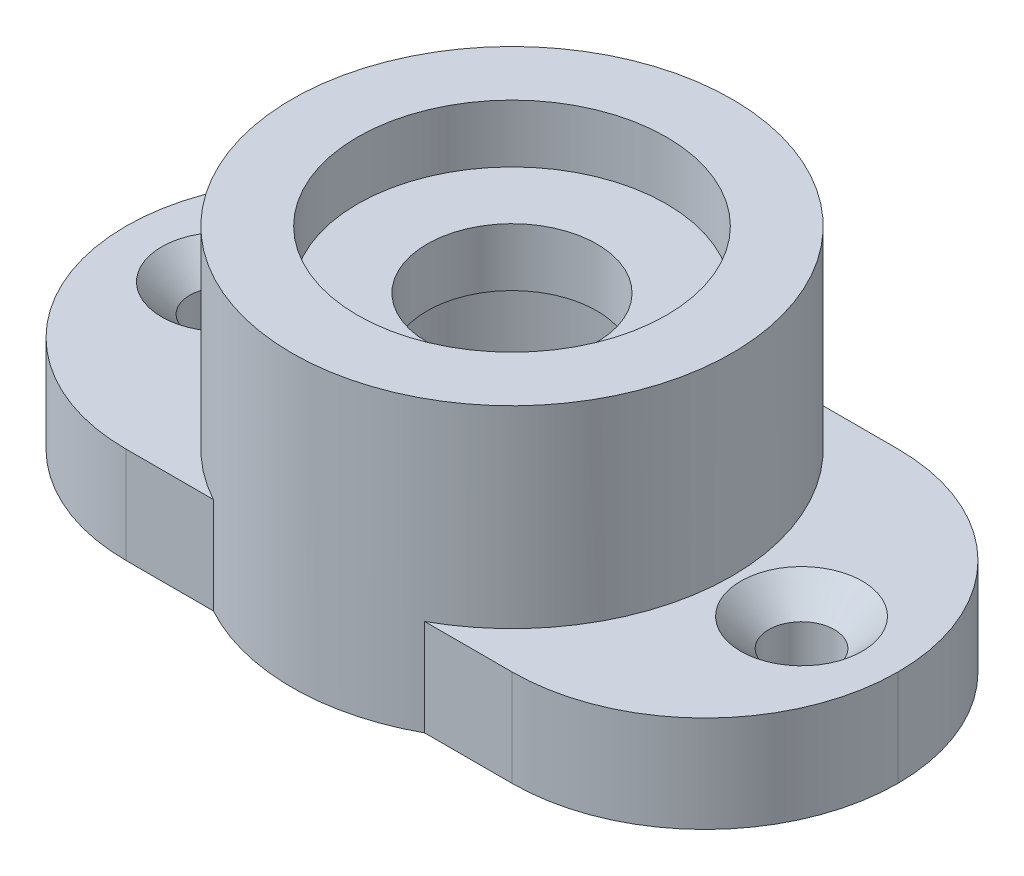
ISO-10303-21;
HEADER;
FILE_DESCRIPTION(('STEP AP214'),'2;1');
FILE_NAME('part.step','',(''),(''),'','','');
FILE_SCHEMA(('AUTOMOTIVE_DESIGN { 1 0 10303 214 1 1 1 1 }'));
ENDSEC;
DATA;
#1=APPLICATION_CONTEXT('core data for automotive mechanical design processes');
#2=APPLICATION_PROTOCOL_DEFINITION('international standard','automotive_design',2000,#1);
#3=PRODUCT_CONTEXT('',#1,'mechanical');
#4=PRODUCT('Part','Part','',(#3));
#5=PRODUCT_RELATED_PRODUCT_CATEGORY('part','',(#4));
#6=PRODUCT_DEFINITION_FORMATION('','',#4);
#7=PRODUCT_DEFINITION_CONTEXT('part definition',#1,'design');
#8=PRODUCT_DEFINITION('design','',#6,#7);
#9=PRODUCT_DEFINITION_SHAPE('','',#8);
#10=(LENGTH_UNIT() NAMED_UNIT(*) SI_UNIT(.MILLI.,.METRE.));
#11=(NAMED_UNIT(*) PLANE_ANGLE_UNIT() SI_UNIT($,.RADIAN.));
#12=(NAMED_UNIT(*) SI_UNIT($,.STERADIAN.) SOLID_ANGLE_UNIT());
#13=UNCERTAINTY_MEASURE_WITH_UNIT(LENGTH_MEASURE(1.E-05),#10,'distance_accuracy_value','');
#14=(GEOMETRIC_REPRESENTATION_CONTEXT(3) GLOBAL_UNCERTAINTY_ASSIGNED_CONTEXT((#13)) GLOBAL_UNIT_ASSIGNED_CONTEXT((#10,
#11,#12)) REPRESENTATION_CONTEXT('',''));
#15=CARTESIAN_POINT('',(0.,0.,0.));
#16=DIRECTION('',(0.,0.,1.));
#17=DIRECTION('',(1.,0.,0.));
#18=AXIS2_PLACEMENT_3D('',#15,#16,#17);
#19=CARTESIAN_POINT('',(-20.,5.,-10.));
#20=DIRECTION('',(0.,0.,1.));
#21=DIRECTION('',(1.,0.,0.));
#22=AXIS2_PLACEMENT_3D('',#19,#20,#21);
#23=PLANE('',#22);
#24=DIRECTION('',(-1.,0.,0.));
#25=VECTOR('',#24,1.);
#26=CARTESIAN_POINT('',(-20.,5.,-10.));
#27=LINE('',#26,#25);
#28=CARTESIAN_POINT('',(-5.4735728733616,5.,-10.));
#29=VERTEX_POINT('',#28);
#30=CARTESIAN_POINT('',(-10.,5.,-10.));
#31=VERTEX_POINT('',#30);
#32=EDGE_CURVE('E128',#29,#31,#27,.T.);
#33=ORIENTED_EDGE('',*,*,#32,.F.);
#34=DIRECTION('',(0.,-1.,0.));
#35=VECTOR('',#34,1.);
#36=CARTESIAN_POINT('',(-5.47357287336161,16.0363037290571,-10.));
#37=LINE('',#36,#35);
#38=CARTESIAN_POINT('',(-5.47357287336161,0.,-10.));
#39=VERTEX_POINT('',#38);
#40=EDGE_CURVE('E116',#29,#39,#37,.T.);
#41=ORIENTED_EDGE('',*,*,#40,.T.);
#42=DIRECTION('',(-1.,0.,0.));
#43=VECTOR('',#42,1.);
#44=CARTESIAN_POINT('',(-20.,0.,-10.));
#45=LINE('',#44,#43);
#46=CARTESIAN_POINT('',(-10.,0.,-10.));
#47=VERTEX_POINT('',#46);
#48=EDGE_CURVE('E126',#39,#47,#45,.T.);
#49=ORIENTED_EDGE('',*,*,#48,.T.);
#50=DIRECTION('',(0.,-1.,0.));
#51=VECTOR('',#50,1.);
#52=CARTESIAN_POINT('',(-10.,5.,-10.));
#53=LINE('',#52,#51);
#54=EDGE_CURVE('E167',#47,#31,#53,.F.);
#55=ORIENTED_EDGE('',*,*,#54,.T.);
#56=EDGE_LOOP('',(#33,#41,#49,#55));
#57=FACE_BOUND('',#56,.T.);
#58=ADVANCED_FACE('F35',(#57),#23,.F.);
#59=CARTESIAN_POINT('',(-20.,5.,10.));
#60=DIRECTION('',(0.,0.,-1.));
#61=DIRECTION('',(-1.,0.,0.));
#62=AXIS2_PLACEMENT_3D('',#59,#60,#61);
#63=PLANE('',#62);
#64=DIRECTION('',(1.,0.,0.));
#65=VECTOR('',#64,1.);
#66=CARTESIAN_POINT('',(-20.,5.,10.));
#67=LINE('',#66,#65);
#68=CARTESIAN_POINT('',(5.4735728733616,5.,10.));
#69=VERTEX_POINT('',#68);
#70=CARTESIAN_POINT('',(9.99999999999999,5.,10.));
#71=VERTEX_POINT('',#70);
#72=EDGE_CURVE('E206',#69,#71,#67,.T.);
#73=ORIENTED_EDGE('',*,*,#72,.F.);
#74=DIRECTION('',(0.,-1.,0.));
#75=VECTOR('',#74,1.);
#76=CARTESIAN_POINT('',(5.47357287336161,16.0363037290571,10.));
#77=LINE('',#76,#75);
#78=CARTESIAN_POINT('',(5.47357287336161,0.,10.));
#79=VERTEX_POINT('',#78);
#80=EDGE_CURVE('E221',#69,#79,#77,.T.);
#81=ORIENTED_EDGE('',*,*,#80,.T.);
#82=DIRECTION('',(1.,0.,0.));
#83=VECTOR('',#82,1.);
#84=CARTESIAN_POINT('',(-20.,0.,10.));
#85=LINE('',#84,#83);
#86=CARTESIAN_POINT('',(9.99999999999999,0.,10.));
#87=VERTEX_POINT('',#86);
#88=EDGE_CURVE('E136',#79,#87,#85,.T.);
#89=ORIENTED_EDGE('',*,*,#88,.T.);
#90=DIRECTION('',(0.,-1.,0.));
#91=VECTOR('',#90,1.);
#92=CARTESIAN_POINT('',(9.99999999999999,5.,10.));
#93=LINE('',#92,#91);
#94=EDGE_CURVE('E158',#87,#71,#93,.F.);
#95=ORIENTED_EDGE('',*,*,#94,.T.);
#96=EDGE_LOOP('',(#73,#81,#89,#95));
#97=FACE_BOUND('',#96,.T.);
#98=ADVANCED_FACE('F243',(#97),#63,.F.);
#99=CARTESIAN_POINT('',(0.,0.,0.));
#100=DIRECTION('',(0.,1.,0.));
#101=DIRECTION('',(0.,0.,1.));
#102=AXIS2_PLACEMENT_3D('',#99,#100,#101);
#103=CYLINDRICAL_SURFACE('',#102,4.4);
#104=CARTESIAN_POINT('',(0.,9.,0.));
#105=DIRECTION('',(0.,1.,0.));
#106=DIRECTION('',(0.,0.,1.));
#107=AXIS2_PLACEMENT_3D('',#104,#105,#106);
#108=CIRCLE('',#107,4.4);
#109=CARTESIAN_POINT('',(0.,9.,4.4));
#110=VERTEX_POINT('',#109);
#111=EDGE_CURVE('E39',#110,#110,#108,.F.);
#112=ORIENTED_EDGE('',*,*,#111,.T.);
#113=EDGE_LOOP('',(#112));
#114=FACE_BOUND('',#113,.T.);
#115=CARTESIAN_POINT('',(0.,12.,0.));
#116=DIRECTION('',(0.,1.,0.));
#117=DIRECTION('',(0.,0.,1.));
#118=AXIS2_PLACEMENT_3D('',#115,#116,#117);
#119=CIRCLE('',#118,4.4);
#120=CARTESIAN_POINT('',(0.,12.,4.4));
#121=VERTEX_POINT('',#120);
#122=EDGE_CURVE('E182',#121,#121,#119,.T.);
#123=ORIENTED_EDGE('',*,*,#122,.T.);
#124=EDGE_LOOP('',(#123));
#125=FACE_BOUND('',#124,.T.);
#126=ADVANCED_FACE('F249',(#114,#125),#103,.F.);
#127=CARTESIAN_POINT('',(0.,5.,0.));
#128=DIRECTION('',(0.,-1.,0.));
#129=DIRECTION('',(0.,0.,-1.));
#130=AXIS2_PLACEMENT_3D('',#127,#128,#129);
#131=PLANE('',#130);
#132=ORIENTED_EDGE('',*,*,#72,.T.);
#133=CARTESIAN_POINT('',(10.,5.,0.));
#134=DIRECTION('',(0.,-1.,0.));
#135=DIRECTION('',(0.,0.,-1.));
#136=AXIS2_PLACEMENT_3D('',#133,#134,#135);
#137=CIRCLE('',#136,10.);
#138=CARTESIAN_POINT('',(20.,5.,0.));
#139=VERTEX_POINT('',#138);
#140=EDGE_CURVE('E163',#71,#139,#137,.F.);
#141=ORIENTED_EDGE('',*,*,#140,.T.);
#142=CARTESIAN_POINT('',(9.99999999999999,5.,0.));
#143=DIRECTION('',(0.,-1.,0.));
#144=DIRECTION('',(0.,0.,-1.));
#145=AXIS2_PLACEMENT_3D('',#142,#143,#144);
#146=CIRCLE('',#145,10.);
#147=CARTESIAN_POINT('',(9.99999999999999,5.,-10.));
#148=VERTEX_POINT('',#147);
#149=EDGE_CURVE('E161',#139,#148,#146,.F.);
#150=ORIENTED_EDGE('',*,*,#149,.T.);
#151=CARTESIAN_POINT('',(5.47357287336161,5.,-10.));
#152=VERTEX_POINT('',#151);
#153=EDGE_CURVE('E204',#148,#152,#27,.T.);
#154=ORIENTED_EDGE('',*,*,#153,.T.);
#155=CARTESIAN_POINT('',(0.,5.,0.));
#156=DIRECTION('',(0.,1.,0.));
#157=DIRECTION('',(0.,0.,1.));
#158=AXIS2_PLACEMENT_3D('',#155,#156,#157);
#159=CIRCLE('',#158,11.4);
#160=EDGE_CURVE('E172',#69,#152,#159,.T.);
#161=ORIENTED_EDGE('',*,*,#160,.F.);
#162=EDGE_LOOP('',(#132,#141,#150,#154,#161));
#163=FACE_BOUND('',#162,.T.);
#164=CARTESIAN_POINT('',(15.,5.,0.));
#165=DIRECTION('',(0.,1.,0.));
#166=DIRECTION('',(0.,0.,1.));
#167=AXIS2_PLACEMENT_3D('',#164,#165,#166);
#168=CIRCLE('',#167,3.15);
#169=CARTESIAN_POINT('',(15.,5.,3.15));
#170=VERTEX_POINT('',#169);
#171=EDGE_CURVE('E200',#170,#170,#168,.T.);
#172=ORIENTED_EDGE('',*,*,#171,.F.);
#173=EDGE_LOOP('',(#172));
#174=FACE_BOUND('',#173,.T.);
#175=ADVANCED_FACE('F254',(#163,#174),#131,.F.);
#176=CARTESIAN_POINT('',(9.99999999999999,0.,-10.));
#177=VERTEX_POINT('',#176);
#178=CARTESIAN_POINT('',(5.47357287336161,0.,-10.));
#179=VERTEX_POINT('',#178);
#180=EDGE_CURVE('E133',#177,#179,#45,.T.);
#181=ORIENTED_EDGE('',*,*,#180,.T.);
#182=DIRECTION('',(0.,-1.,0.));
#183=VECTOR('',#182,1.);
#184=CARTESIAN_POINT('',(5.47357287336161,16.0363037290571,-10.));
#185=LINE('',#184,#183);
#186=EDGE_CURVE('E118',#152,#179,#185,.T.);
#187=ORIENTED_EDGE('',*,*,#186,.F.);
#188=ORIENTED_EDGE('',*,*,#153,.F.);
#189=DIRECTION('',(0.,-1.,0.));
#190=VECTOR('',#189,1.);
#191=CARTESIAN_POINT('',(9.99999999999999,5.,-10.));
#192=LINE('',#191,#190);
#193=EDGE_CURVE('E165',#148,#177,#192,.T.);
#194=ORIENTED_EDGE('',*,*,#193,.T.);
#195=EDGE_LOOP('',(#181,#187,#188,#194));
#196=FACE_BOUND('',#195,.T.);
#197=ADVANCED_FACE('F245',(#196),#23,.F.);
#198=CARTESIAN_POINT('',(-10.,0.,10.));
#199=VERTEX_POINT('',#198);
#200=CARTESIAN_POINT('',(-5.47357287336161,0.,10.));
#201=VERTEX_POINT('',#200);
#202=EDGE_CURVE('E144',#199,#201,#85,.T.);
#203=ORIENTED_EDGE('',*,*,#202,.T.);
#204=DIRECTION('',(0.,-1.,0.));
#205=VECTOR('',#204,1.);
#206=CARTESIAN_POINT('',(-5.47357287336161,16.0363037290571,10.));
#207=LINE('',#206,#205);
#208=CARTESIAN_POINT('',(-5.47357287336161,5.,10.));
#209=VERTEX_POINT('',#208);
#210=EDGE_CURVE('E215',#209,#201,#207,.T.);
#211=ORIENTED_EDGE('',*,*,#210,.F.);
#212=CARTESIAN_POINT('',(-10.,5.,10.));
#213=VERTEX_POINT('',#212);
#214=EDGE_CURVE('E142',#213,#209,#67,.T.);
#215=ORIENTED_EDGE('',*,*,#214,.F.);
#216=DIRECTION('',(0.,-1.,0.));
#217=VECTOR('',#216,1.);
#218=CARTESIAN_POINT('',(-10.,5.,10.));
#219=LINE('',#218,#217);
#220=EDGE_CURVE('E156',#213,#199,#219,.T.);
#221=ORIENTED_EDGE('',*,*,#220,.T.);
#222=EDGE_LOOP('',(#203,#211,#215,#221));
#223=FACE_BOUND('',#222,.T.);
#224=ADVANCED_FACE('F227',(#223),#63,.F.);
#225=ORIENTED_EDGE('',*,*,#32,.T.);
#226=CARTESIAN_POINT('',(-10.,5.,0.));
#227=DIRECTION('',(0.,-1.,0.));
#228=DIRECTION('',(0.,0.,-1.));
#229=AXIS2_PLACEMENT_3D('',#226,#227,#228);
#230=CIRCLE('',#229,10.);
#231=CARTESIAN_POINT('',(-20.,5.,0.));
#232=VERTEX_POINT('',#231);
#233=EDGE_CURVE('E12',#31,#232,#230,.F.);
#234=ORIENTED_EDGE('',*,*,#233,.T.);
#235=CARTESIAN_POINT('',(-10.,5.,0.));
#236=DIRECTION('',(0.,-1.,0.));
#237=DIRECTION('',(0.,0.,-1.));
#238=AXIS2_PLACEMENT_3D('',#235,#236,#237);
#239=CIRCLE('',#238,10.);
#240=EDGE_CURVE('E44',#232,#213,#239,.F.);
#241=ORIENTED_EDGE('',*,*,#240,.T.);
#242=ORIENTED_EDGE('',*,*,#214,.T.);
#243=EDGE_CURVE('E149',#29,#209,#159,.T.);
#244=ORIENTED_EDGE('',*,*,#243,.F.);
#245=EDGE_LOOP('',(#225,#234,#241,#242,#244));
#246=FACE_BOUND('',#245,.T.);
#247=CARTESIAN_POINT('',(-15.,5.,0.));
#248=DIRECTION('',(0.,1.,0.));
#249=DIRECTION('',(0.,0.,1.));
#250=AXIS2_PLACEMENT_3D('',#247,#248,#249);
#251=CIRCLE('',#250,3.15);
#252=CARTESIAN_POINT('',(-15.,5.,3.15));
#253=VERTEX_POINT('',#252);
#254=EDGE_CURVE('E190',#253,#253,#251,.T.);
#255=ORIENTED_EDGE('',*,*,#254,.F.);
#256=EDGE_LOOP('',(#255));
#257=FACE_BOUND('',#256,.T.);
#258=ADVANCED_FACE('F211',(#246,#257),#131,.F.);
#259=CARTESIAN_POINT('',(0.,0.,0.));
#260=DIRECTION('',(0.,-1.,0.));
#261=DIRECTION('',(0.,0.,-1.));
#262=AXIS2_PLACEMENT_3D('',#259,#260,#261);
#263=PLANE('',#262);
#264=CARTESIAN_POINT('',(0.,0.,0.));
#265=DIRECTION('',(0.,-1.,0.));
#266=DIRECTION('',(0.,0.,-1.));
#267=AXIS2_PLACEMENT_3D('',#264,#265,#266);
#268=CIRCLE('',#267,8.);
#269=CARTESIAN_POINT('',(0.,0.,-8.));
#270=VERTEX_POINT('',#269);
#271=EDGE_CURVE('E220',#270,#270,#268,.T.);
#272=ORIENTED_EDGE('',*,*,#271,.F.);
#273=EDGE_LOOP('',(#272));
#274=FACE_BOUND('',#273,.T.);
#275=CARTESIAN_POINT('',(-15.,0.,0.));
#276=DIRECTION('',(0.,1.,0.));
#277=DIRECTION('',(0.,0.,1.));
#278=AXIS2_PLACEMENT_3D('',#275,#276,#277);
#279=CIRCLE('',#278,1.69999999999999);
#280=CARTESIAN_POINT('',(-15.,0.,1.7));
#281=VERTEX_POINT('',#280);
#282=EDGE_CURVE('E197',#281,#281,#279,.T.);
#283=ORIENTED_EDGE('',*,*,#282,.T.);
#284=EDGE_LOOP('',(#283));
#285=FACE_BOUND('',#284,.T.);
#286=CARTESIAN_POINT('',(15.,0.,0.));
#287=DIRECTION('',(0.,1.,0.));
#288=DIRECTION('',(0.,0.,1.));
#289=AXIS2_PLACEMENT_3D('',#286,#287,#288);
#290=CIRCLE('',#289,1.69999999999999);
#291=CARTESIAN_POINT('',(15.,0.,1.69999999999999));
#292=VERTEX_POINT('',#291);
#293=EDGE_CURVE('E134',#292,#292,#290,.T.);
#294=ORIENTED_EDGE('',*,*,#293,.T.);
#295=EDGE_LOOP('',(#294));
#296=FACE_BOUND('',#295,.T.);
#297=CARTESIAN_POINT('',(9.99999999999999,0.,0.));
#298=DIRECTION('',(0.,-1.,0.));
#299=DIRECTION('',(0.,0.,-1.));
#300=AXIS2_PLACEMENT_3D('',#297,#298,#299);
#301=CIRCLE('',#300,10.);
#302=CARTESIAN_POINT('',(20.,0.,0.));
#303=VERTEX_POINT('',#302);
#304=EDGE_CURVE('E151',#177,#303,#301,.T.);
#305=ORIENTED_EDGE('',*,*,#304,.T.);
#306=CARTESIAN_POINT('',(10.,0.,0.));
#307=DIRECTION('',(0.,-1.,0.));
#308=DIRECTION('',(0.,0.,-1.));
#309=AXIS2_PLACEMENT_3D('',#306,#307,#308);
#310=CIRCLE('',#309,10.);
#311=EDGE_CURVE('E153',#303,#87,#310,.T.);
#312=ORIENTED_EDGE('',*,*,#311,.T.);
#313=ORIENTED_EDGE('',*,*,#88,.F.);
#314=CARTESIAN_POINT('',(0.,0.,0.));
#315=DIRECTION('',(0.,-1.,0.));
#316=DIRECTION('',(0.,0.,1.));
#317=AXIS2_PLACEMENT_3D('',#314,#315,#316);
#318=CIRCLE('',#317,11.4);
#319=EDGE_CURVE('E217',#79,#201,#318,.T.);
#320=ORIENTED_EDGE('',*,*,#319,.T.);
#321=ORIENTED_EDGE('',*,*,#202,.F.);
#322=CARTESIAN_POINT('',(-10.,0.,0.));
#323=DIRECTION('',(0.,-1.,0.));
#324=DIRECTION('',(0.,0.,-1.));
#325=AXIS2_PLACEMENT_3D('',#322,#323,#324);
#326=CIRCLE('',#325,10.);
#327=CARTESIAN_POINT('',(-20.,0.,0.));
#328=VERTEX_POINT('',#327);
#329=EDGE_CURVE('E147',#199,#328,#326,.T.);
#330=ORIENTED_EDGE('',*,*,#329,.T.);
#331=CARTESIAN_POINT('',(-10.,0.,0.));
#332=DIRECTION('',(0.,-1.,0.));
#333=DIRECTION('',(0.,0.,-1.));
#334=AXIS2_PLACEMENT_3D('',#331,#332,#333);
#335=CIRCLE('',#334,10.);
#336=EDGE_CURVE('E132',#328,#47,#335,.T.);
#337=ORIENTED_EDGE('',*,*,#336,.T.);
#338=ORIENTED_EDGE('',*,*,#48,.F.);
#339=CARTESIAN_POINT('',(0.,0.,0.));
#340=DIRECTION('',(0.,-1.,0.));
#341=DIRECTION('',(0.,0.,-1.));
#342=AXIS2_PLACEMENT_3D('',#339,#340,#341);
#343=CIRCLE('',#342,11.4);
#344=EDGE_CURVE('E111',#39,#179,#343,.T.);
#345=ORIENTED_EDGE('',*,*,#344,.T.);
#346=ORIENTED_EDGE('',*,*,#180,.F.);
#347=EDGE_LOOP('',(#305,#312,#313,#320,#321,#330,#337,#338,#345,#346));
#348=FACE_BOUND('',#347,.T.);
#349=ADVANCED_FACE('F130',(#274,#285,#296,#348),#263,.T.);
#350=CARTESIAN_POINT('',(15.,5.,0.));
#351=DIRECTION('',(0.,1.,0.));
#352=DIRECTION('',(0.,0.,1.));
#353=AXIS2_PLACEMENT_3D('',#350,#351,#352);
#354=CYLINDRICAL_SURFACE('',#353,1.69999999999999);
#355=ORIENTED_EDGE('',*,*,#293,.F.);
#356=EDGE_LOOP('',(#355));
#357=FACE_BOUND('',#356,.T.);
#358=CARTESIAN_POINT('',(15.,3.55,0.));
#359=DIRECTION('',(0.,1.,0.));
#360=DIRECTION('',(0.,0.,1.));
#361=AXIS2_PLACEMENT_3D('',#358,#359,#360);
#362=CIRCLE('',#361,1.69999999999999);
#363=CARTESIAN_POINT('',(15.,3.55,1.69999999999999));
#364=VERTEX_POINT('',#363);
#365=EDGE_CURVE('E138',#364,#364,#362,.T.);
#366=ORIENTED_EDGE('',*,*,#365,.T.);
#367=EDGE_LOOP('',(#366));
#368=FACE_BOUND('',#367,.T.);
#369=ADVANCED_FACE('F317',(#357,#368),#354,.F.);
#370=CARTESIAN_POINT('',(15.,5.,0.));
#371=DIRECTION('',(0.,1.,0.));
#372=DIRECTION('',(0.,0.,1.));
#373=AXIS2_PLACEMENT_3D('',#370,#371,#372);
#374=CONICAL_SURFACE('',#373,3.15,0.78539816339745);
#375=ORIENTED_EDGE('',*,*,#365,.F.);
#376=EDGE_LOOP('',(#375));
#377=FACE_BOUND('',#376,.T.);
#378=ORIENTED_EDGE('',*,*,#171,.T.);
#379=EDGE_LOOP('',(#378));
#380=FACE_BOUND('',#379,.T.);
#381=ADVANCED_FACE('F313',(#377,#380),#374,.F.);
#382=CARTESIAN_POINT('',(-15.,5.,0.));
#383=DIRECTION('',(0.,1.,0.));
#384=DIRECTION('',(0.,0.,1.));
#385=AXIS2_PLACEMENT_3D('',#382,#383,#384);
#386=CYLINDRICAL_SURFACE('',#385,1.69999999999999);
#387=ORIENTED_EDGE('',*,*,#282,.F.);
#388=EDGE_LOOP('',(#387));
#389=FACE_BOUND('',#388,.T.);
#390=CARTESIAN_POINT('',(-15.,3.55,0.));
#391=DIRECTION('',(0.,1.,0.));
#392=DIRECTION('',(0.,0.,1.));
#393=AXIS2_PLACEMENT_3D('',#390,#391,#392);
#394=CIRCLE('',#393,1.69999999999999);
#395=CARTESIAN_POINT('',(-15.,3.55,1.7));
#396=VERTEX_POINT('',#395);
#397=EDGE_CURVE('E194',#396,#396,#394,.T.);
#398=ORIENTED_EDGE('',*,*,#397,.T.);
#399=EDGE_LOOP('',(#398));
#400=FACE_BOUND('',#399,.T.);
#401=ADVANCED_FACE('F309',(#389,#400),#386,.F.);
#402=CARTESIAN_POINT('',(-15.,5.,0.));
#403=DIRECTION('',(0.,1.,0.));
#404=DIRECTION('',(0.,0.,1.));
#405=AXIS2_PLACEMENT_3D('',#402,#403,#404);
#406=CONICAL_SURFACE('',#405,3.15,0.78539816339745);
#407=ORIENTED_EDGE('',*,*,#397,.F.);
#408=EDGE_LOOP('',(#407));
#409=FACE_BOUND('',#408,.T.);
#410=ORIENTED_EDGE('',*,*,#254,.T.);
#411=EDGE_LOOP('',(#410));
#412=FACE_BOUND('',#411,.T.);
#413=ADVANCED_FACE('F300',(#409,#412),#406,.F.);
#414=CARTESIAN_POINT('',(0.,15.,0.));
#415=DIRECTION('',(0.,1.,0.));
#416=DIRECTION('',(0.,0.,1.));
#417=AXIS2_PLACEMENT_3D('',#414,#415,#416);
#418=PLANE('',#417);
#419=CARTESIAN_POINT('',(0.,15.,0.));
#420=DIRECTION('',(0.,1.,0.));
#421=DIRECTION('',(0.,0.,1.));
#422=AXIS2_PLACEMENT_3D('',#419,#420,#421);
#423=CIRCLE('',#422,8.);
#424=CARTESIAN_POINT('',(0.,15.,8.));
#425=VERTEX_POINT('',#424);
#426=EDGE_CURVE('E177',#425,#425,#423,.T.);
#427=ORIENTED_EDGE('',*,*,#426,.F.);
#428=EDGE_LOOP('',(#427));
#429=FACE_BOUND('',#428,.T.);
#430=CARTESIAN_POINT('',(0.,15.,0.));
#431=DIRECTION('',(0.,1.,0.));
#432=DIRECTION('',(0.,0.,1.));
#433=AXIS2_PLACEMENT_3D('',#430,#431,#432);
#434=CIRCLE('',#433,11.4);
#435=CARTESIAN_POINT('',(0.,15.,11.4));
#436=VERTEX_POINT('',#435);
#437=EDGE_CURVE('E187',#436,#436,#434,.T.);
#438=ORIENTED_EDGE('',*,*,#437,.T.);
#439=EDGE_LOOP('',(#438));
#440=FACE_BOUND('',#439,.T.);
#441=ADVANCED_FACE('F297',(#429,#440),#418,.T.);
#442=CARTESIAN_POINT('',(0.,15.,0.));
#443=DIRECTION('',(0.,-1.,0.));
#444=DIRECTION('',(0.,0.,-1.));
#445=AXIS2_PLACEMENT_3D('',#442,#443,#444);
#446=CYLINDRICAL_SURFACE('',#445,11.4);
#447=ORIENTED_EDGE('',*,*,#437,.F.);
#448=EDGE_LOOP('',(#447));
#449=FACE_BOUND('',#448,.T.);
#450=ORIENTED_EDGE('',*,*,#160,.T.);
#451=ORIENTED_EDGE('',*,*,#186,.T.);
#452=ORIENTED_EDGE('',*,*,#344,.F.);
#453=ORIENTED_EDGE('',*,*,#40,.F.);
#454=ORIENTED_EDGE('',*,*,#243,.T.);
#455=ORIENTED_EDGE('',*,*,#210,.T.);
#456=ORIENTED_EDGE('',*,*,#319,.F.);
#457=ORIENTED_EDGE('',*,*,#80,.F.);
#458=EDGE_LOOP('',(#450,#451,#452,#453,#454,#455,#456,#457));
#459=FACE_BOUND('',#458,.T.);
#460=ADVANCED_FACE('F114',(#449,#459),#446,.T.);
#461=CARTESIAN_POINT('',(9.99999999999999,5.,0.));
#462=DIRECTION('',(0.,-1.,0.));
#463=DIRECTION('',(0.,0.,-1.));
#464=AXIS2_PLACEMENT_3D('',#461,#462,#463);
#465=CYLINDRICAL_SURFACE('',#464,10.);
#466=ORIENTED_EDGE('',*,*,#193,.F.);
#467=ORIENTED_EDGE('',*,*,#149,.F.);
#468=DIRECTION('',(0.,-1.,0.));
#469=VECTOR('',#468,1.);
#470=CARTESIAN_POINT('',(20.,5.,0.));
#471=LINE('',#470,#469);
#472=EDGE_CURVE('E170',#303,#139,#471,.F.);
#473=ORIENTED_EDGE('',*,*,#472,.F.);
#474=ORIENTED_EDGE('',*,*,#304,.F.);
#475=EDGE_LOOP('',(#466,#467,#473,#474));
#476=FACE_BOUND('',#475,.T.);
#477=ADVANCED_FACE('F265',(#476),#465,.T.);
#478=CARTESIAN_POINT('',(10.,5.,0.));
#479=DIRECTION('',(0.,-1.,0.));
#480=DIRECTION('',(0.,0.,-1.));
#481=AXIS2_PLACEMENT_3D('',#478,#479,#480);
#482=CYLINDRICAL_SURFACE('',#481,10.);
#483=ORIENTED_EDGE('',*,*,#140,.F.);
#484=ORIENTED_EDGE('',*,*,#94,.F.);
#485=ORIENTED_EDGE('',*,*,#311,.F.);
#486=ORIENTED_EDGE('',*,*,#472,.T.);
#487=EDGE_LOOP('',(#483,#484,#485,#486));
#488=FACE_BOUND('',#487,.T.);
#489=ADVANCED_FACE('F240',(#488),#482,.T.);
#490=CARTESIAN_POINT('',(-10.,5.,0.));
#491=DIRECTION('',(0.,-1.,0.));
#492=DIRECTION('',(0.,0.,-1.));
#493=AXIS2_PLACEMENT_3D('',#490,#491,#492);
#494=CYLINDRICAL_SURFACE('',#493,10.);
#495=ORIENTED_EDGE('',*,*,#220,.F.);
#496=ORIENTED_EDGE('',*,*,#240,.F.);
#497=DIRECTION('',(0.,-1.,0.));
#498=VECTOR('',#497,1.);
#499=CARTESIAN_POINT('',(-20.,5.,0.));
#500=LINE('',#499,#498);
#501=EDGE_CURVE('E173',#328,#232,#500,.F.);
#502=ORIENTED_EDGE('',*,*,#501,.F.);
#503=ORIENTED_EDGE('',*,*,#329,.F.);
#504=EDGE_LOOP('',(#495,#496,#502,#503));
#505=FACE_BOUND('',#504,.T.);
#506=ADVANCED_FACE('F37',(#505),#494,.T.);
#507=CARTESIAN_POINT('',(-10.,5.,0.));
#508=DIRECTION('',(0.,-1.,0.));
#509=DIRECTION('',(0.,0.,-1.));
#510=AXIS2_PLACEMENT_3D('',#507,#508,#509);
#511=CYLINDRICAL_SURFACE('',#510,10.);
#512=ORIENTED_EDGE('',*,*,#233,.F.);
#513=ORIENTED_EDGE('',*,*,#54,.F.);
#514=ORIENTED_EDGE('',*,*,#336,.F.);
#515=ORIENTED_EDGE('',*,*,#501,.T.);
#516=EDGE_LOOP('',(#512,#513,#514,#515));
#517=FACE_BOUND('',#516,.T.);
#518=ADVANCED_FACE('F230',(#517),#511,.T.);
#519=CARTESIAN_POINT('',(0.,12.,0.));
#520=DIRECTION('',(0.,1.,0.));
#521=DIRECTION('',(0.,0.,1.));
#522=AXIS2_PLACEMENT_3D('',#519,#520,#521);
#523=CYLINDRICAL_SURFACE('',#522,8.);
#524=CARTESIAN_POINT('',(0.,12.,0.));
#525=DIRECTION('',(0.,1.,0.));
#526=DIRECTION('',(0.,0.,1.));
#527=AXIS2_PLACEMENT_3D('',#524,#525,#526);
#528=CIRCLE('',#527,8.);
#529=CARTESIAN_POINT('',(0.,12.,8.));
#530=VERTEX_POINT('',#529);
#531=EDGE_CURVE('E174',#530,#530,#528,.T.);
#532=ORIENTED_EDGE('',*,*,#531,.F.);
#533=EDGE_LOOP('',(#532));
#534=FACE_BOUND('',#533,.T.);
#535=ORIENTED_EDGE('',*,*,#426,.T.);
#536=EDGE_LOOP('',(#535));
#537=FACE_BOUND('',#536,.T.);
#538=ADVANCED_FACE('F232',(#534,#537),#523,.F.);
#539=CARTESIAN_POINT('',(0.,12.,0.));
#540=DIRECTION('',(0.,1.,0.));
#541=DIRECTION('',(0.,0.,1.));
#542=AXIS2_PLACEMENT_3D('',#539,#540,#541);
#543=PLANE('',#542);
#544=ORIENTED_EDGE('',*,*,#122,.F.);
#545=EDGE_LOOP('',(#544));
#546=FACE_BOUND('',#545,.T.);
#547=ORIENTED_EDGE('',*,*,#531,.T.);
#548=EDGE_LOOP('',(#547));
#549=FACE_BOUND('',#548,.T.);
#550=ADVANCED_FACE('F237',(#546,#549),#543,.T.);
#551=CARTESIAN_POINT('',(0.,9.,0.));
#552=DIRECTION('',(0.,1.,0.));
#553=DIRECTION('',(0.,0.,1.));
#554=AXIS2_PLACEMENT_3D('',#551,#552,#553);
#555=PLANE('',#554);
#556=CARTESIAN_POINT('',(0.,9.,0.));
#557=DIRECTION('',(0.,1.,0.));
#558=DIRECTION('',(0.,0.,1.));
#559=AXIS2_PLACEMENT_3D('',#556,#557,#558);
#560=CIRCLE('',#559,8.);
#561=CARTESIAN_POINT('',(0.,9.,8.));
#562=VERTEX_POINT('',#561);
#563=EDGE_CURVE('E276',#562,#562,#560,.F.);
#564=ORIENTED_EDGE('',*,*,#563,.T.);
#565=EDGE_LOOP('',(#564));
#566=FACE_BOUND('',#565,.T.);
#567=ORIENTED_EDGE('',*,*,#111,.F.);
#568=EDGE_LOOP('',(#567));
#569=FACE_BOUND('',#568,.T.);
#570=ADVANCED_FACE('F288',(#566,#569),#555,.F.);
#571=CARTESIAN_POINT('',(0.,34.6274169979695,0.));
#572=DIRECTION('',(0.,-1.,0.));
#573=DIRECTION('',(0.,0.,-1.));
#574=AXIS2_PLACEMENT_3D('',#571,#572,#573);
#575=CYLINDRICAL_SURFACE('',#574,8.);
#576=ORIENTED_EDGE('',*,*,#271,.T.);
#577=EDGE_LOOP('',(#576));
#578=FACE_BOUND('',#577,.T.);
#579=ORIENTED_EDGE('',*,*,#563,.F.);
#580=EDGE_LOOP('',(#579));
#581=FACE_BOUND('',#580,.T.);
#582=ADVANCED_FACE('F293',(#578,#581),#575,.F.);
#583=CLOSED_SHELL('',(#58,#98,#126,#175,#197,#224,#258,#349,#369,#381,#401,#413,#441,#460,#477,
#489,#506,#518,#538,#550,#570,#582));
#584=MANIFOLD_SOLID_BREP('B2',#583);
#585=ADVANCED_BREP_SHAPE_REPRESENTATION('',(#18,#584),#14);
#586=SHAPE_DEFINITION_REPRESENTATION(#9,#585);
ENDSEC;
END-ISO-10303-21;
